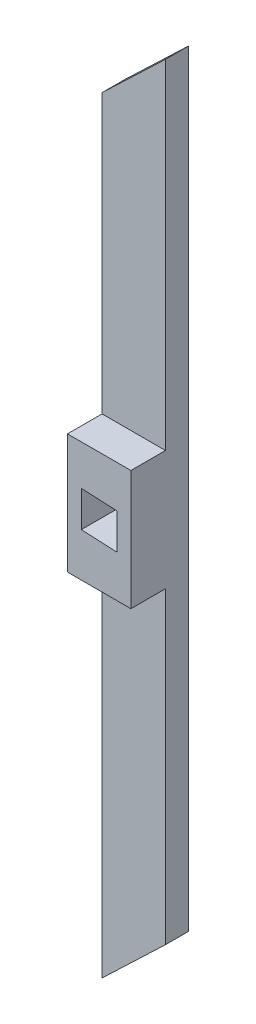
ISO-10303-21;
HEADER;
FILE_DESCRIPTION(('STEP AP214'),'2;1');
FILE_NAME('part.step','',(''),(''),'','','');
FILE_SCHEMA(('AUTOMOTIVE_DESIGN { 1 0 10303 214 1 1 1 1 }'));
ENDSEC;
DATA;
#1=APPLICATION_CONTEXT('core data for automotive mechanical design processes');
#2=APPLICATION_PROTOCOL_DEFINITION('international standard','automotive_design',2000,#1);
#3=PRODUCT_CONTEXT('',#1,'mechanical');
#4=PRODUCT('Part','Part','',(#3));
#5=PRODUCT_RELATED_PRODUCT_CATEGORY('part','',(#4));
#6=PRODUCT_DEFINITION_FORMATION('','',#4);
#7=PRODUCT_DEFINITION_CONTEXT('part definition',#1,'design');
#8=PRODUCT_DEFINITION('design','',#6,#7);
#9=PRODUCT_DEFINITION_SHAPE('','',#8);
#10=(LENGTH_UNIT() NAMED_UNIT(*) SI_UNIT(.MILLI.,.METRE.));
#11=(NAMED_UNIT(*) PLANE_ANGLE_UNIT() SI_UNIT($,.RADIAN.));
#12=(NAMED_UNIT(*) SI_UNIT($,.STERADIAN.) SOLID_ANGLE_UNIT());
#13=UNCERTAINTY_MEASURE_WITH_UNIT(LENGTH_MEASURE(1.E-05),#10,'distance_accuracy_value','');
#14=(GEOMETRIC_REPRESENTATION_CONTEXT(3) GLOBAL_UNCERTAINTY_ASSIGNED_CONTEXT((#13)) GLOBAL_UNIT_ASSIGNED_CONTEXT((#10,
#11,#12)) REPRESENTATION_CONTEXT('',''));
#15=CARTESIAN_POINT('',(0.,0.,0.));
#16=DIRECTION('',(0.,0.,1.));
#17=DIRECTION('',(1.,0.,0.));
#18=AXIS2_PLACEMENT_3D('',#15,#16,#17);
#19=CARTESIAN_POINT('',(34.212972972973,-35.8421621621622,10.));
#20=DIRECTION('',(0.6904757466825,-0.723355544143572,0.));
#21=DIRECTION('',(0.723355544143572,0.690475746682501,0.));
#22=AXIS2_PLACEMENT_3D('',#19,#20,#21);
#23=PLANE('',#22);
#24=DIRECTION('',(0.723355544143572,0.690475746682501,0.));
#25=VECTOR('',#24,1.);
#26=CARTESIAN_POINT('',(34.212972972973,-35.8421621621622,4.));
#27=LINE('',#26,#25);
#28=CARTESIAN_POINT('',(0.,-68.5,4.));
#29=VERTEX_POINT('',#28);
#30=CARTESIAN_POINT('',(11.,-58.,4.));
#31=VERTEX_POINT('',#30);
#32=EDGE_CURVE('E188',#29,#31,#27,.T.);
#33=ORIENTED_EDGE('',*,*,#32,.F.);
#34=DIRECTION('',(0.,0.,-1.));
#35=VECTOR('',#34,1.);
#36=CARTESIAN_POINT('',(0.,-68.5,10.));
#37=LINE('',#36,#35);
#38=CARTESIAN_POINT('',(0.,-68.5,0.));
#39=VERTEX_POINT('',#38);
#40=EDGE_CURVE('E156',#29,#39,#37,.T.);
#41=ORIENTED_EDGE('',*,*,#40,.T.);
#42=DIRECTION('',(-0.723355544143572,-0.690475746682501,0.));
#43=VECTOR('',#42,1.);
#44=CARTESIAN_POINT('',(34.212972972973,-35.8421621621622,0.));
#45=LINE('',#44,#43);
#46=CARTESIAN_POINT('',(11.,-58.,0.));
#47=VERTEX_POINT('',#46);
#48=EDGE_CURVE('E164',#47,#39,#45,.T.);
#49=ORIENTED_EDGE('',*,*,#48,.F.);
#50=DIRECTION('',(0.,0.,-1.));
#51=VECTOR('',#50,1.);
#52=CARTESIAN_POINT('',(11.,-58.,10.));
#53=LINE('',#52,#51);
#54=EDGE_CURVE('E158',#31,#47,#53,.T.);
#55=ORIENTED_EDGE('',*,*,#54,.F.);
#56=EDGE_LOOP('',(#33,#41,#49,#55));
#57=FACE_BOUND('',#56,.T.);
#58=ADVANCED_FACE('F41',(#57),#23,.T.);
#59=CARTESIAN_POINT('',(11.,0.,10.));
#60=DIRECTION('',(1.,0.,0.));
#61=DIRECTION('',(0.,1.,0.));
#62=AXIS2_PLACEMENT_3D('',#59,#60,#61);
#63=PLANE('',#62);
#64=DIRECTION('',(0.,0.,-1.));
#65=VECTOR('',#64,1.);
#66=CARTESIAN_POINT('',(11.,16.2385989171019,10.));
#67=LINE('',#66,#65);
#68=CARTESIAN_POINT('',(11.,16.2385989171019,10.));
#69=VERTEX_POINT('',#68);
#70=CARTESIAN_POINT('',(11.,16.2385989171019,4.));
#71=VERTEX_POINT('',#70);
#72=EDGE_CURVE('E141',#69,#71,#67,.T.);
#73=ORIENTED_EDGE('',*,*,#72,.F.);
#74=DIRECTION('',(0.,-1.,0.));
#75=VECTOR('',#74,1.);
#76=CARTESIAN_POINT('',(11.,0.,10.));
#77=LINE('',#76,#75);
#78=CARTESIAN_POINT('',(11.,-4.52546343834662,10.));
#79=VERTEX_POINT('',#78);
#80=EDGE_CURVE('E150',#69,#79,#77,.T.);
#81=ORIENTED_EDGE('',*,*,#80,.T.);
#82=DIRECTION('',(0.,0.,1.));
#83=VECTOR('',#82,1.);
#84=CARTESIAN_POINT('',(11.,-4.52546343834662,10.));
#85=LINE('',#84,#83);
#86=CARTESIAN_POINT('',(11.,-4.52546343834662,4.));
#87=VERTEX_POINT('',#86);
#88=EDGE_CURVE('E56',#87,#79,#85,.T.);
#89=ORIENTED_EDGE('',*,*,#88,.F.);
#90=DIRECTION('',(0.,1.,0.));
#91=VECTOR('',#90,1.);
#92=CARTESIAN_POINT('',(11.,0.,4.));
#93=LINE('',#92,#91);
#94=EDGE_CURVE('E190',#31,#87,#93,.T.);
#95=ORIENTED_EDGE('',*,*,#94,.F.);
#96=ORIENTED_EDGE('',*,*,#54,.T.);
#97=DIRECTION('',(0.,-1.,0.));
#98=VECTOR('',#97,1.);
#99=CARTESIAN_POINT('',(11.,0.,0.));
#100=LINE('',#99,#98);
#101=CARTESIAN_POINT('',(11.,75.,0.));
#102=VERTEX_POINT('',#101);
#103=EDGE_CURVE('E167',#102,#47,#100,.T.);
#104=ORIENTED_EDGE('',*,*,#103,.F.);
#105=DIRECTION('',(0.,0.,-1.));
#106=VECTOR('',#105,1.);
#107=CARTESIAN_POINT('',(11.,75.,10.));
#108=LINE('',#107,#106);
#109=CARTESIAN_POINT('',(11.,75.,4.));
#110=VERTEX_POINT('',#109);
#111=EDGE_CURVE('E168',#110,#102,#108,.T.);
#112=ORIENTED_EDGE('',*,*,#111,.F.);
#113=DIRECTION('',(0.,1.,0.));
#114=VECTOR('',#113,1.);
#115=CARTESIAN_POINT('',(11.,0.,4.));
#116=LINE('',#115,#114);
#117=EDGE_CURVE('E64',#71,#110,#116,.T.);
#118=ORIENTED_EDGE('',*,*,#117,.F.);
#119=EDGE_LOOP('',(#73,#81,#89,#95,#96,#104,#112,#118));
#120=FACE_BOUND('',#119,.T.);
#121=ADVANCED_FACE('F185',(#120),#63,.T.);
#122=CARTESIAN_POINT('',(0.,0.,10.));
#123=DIRECTION('',(1.,0.,0.));
#124=DIRECTION('',(0.,1.,0.));
#125=AXIS2_PLACEMENT_3D('',#122,#123,#124);
#126=PLANE('',#125);
#127=DIRECTION('',(0.,-1.,0.));
#128=VECTOR('',#127,1.);
#129=CARTESIAN_POINT('',(0.,0.,10.));
#130=LINE('',#129,#128);
#131=CARTESIAN_POINT('',(0.,16.2385989171019,10.));
#132=VERTEX_POINT('',#131);
#133=CARTESIAN_POINT('',(0.,-4.52546343834662,10.));
#134=VERTEX_POINT('',#133);
#135=EDGE_CURVE('E148',#132,#134,#130,.T.);
#136=ORIENTED_EDGE('',*,*,#135,.F.);
#137=DIRECTION('',(0.,0.,-1.));
#138=VECTOR('',#137,1.);
#139=CARTESIAN_POINT('',(0.,16.2385989171019,10.));
#140=LINE('',#139,#138);
#141=CARTESIAN_POINT('',(0.,16.2385989171019,4.));
#142=VERTEX_POINT('',#141);
#143=EDGE_CURVE('E132',#132,#142,#140,.T.);
#144=ORIENTED_EDGE('',*,*,#143,.T.);
#145=DIRECTION('',(0.,1.,0.));
#146=VECTOR('',#145,1.);
#147=CARTESIAN_POINT('',(0.,0.,4.));
#148=LINE('',#147,#146);
#149=CARTESIAN_POINT('',(0.,64.5,4.));
#150=VERTEX_POINT('',#149);
#151=EDGE_CURVE('E445',#142,#150,#148,.T.);
#152=ORIENTED_EDGE('',*,*,#151,.T.);
#153=DIRECTION('',(0.,0.,-1.));
#154=VECTOR('',#153,1.);
#155=CARTESIAN_POINT('',(0.,64.5,10.));
#156=LINE('',#155,#154);
#157=CARTESIAN_POINT('',(0.,64.5,0.));
#158=VERTEX_POINT('',#157);
#159=EDGE_CURVE('E178',#150,#158,#156,.T.);
#160=ORIENTED_EDGE('',*,*,#159,.T.);
#161=DIRECTION('',(0.,-1.,0.));
#162=VECTOR('',#161,1.);
#163=CARTESIAN_POINT('',(0.,0.,0.));
#164=LINE('',#163,#162);
#165=EDGE_CURVE('E160',#158,#39,#164,.T.);
#166=ORIENTED_EDGE('',*,*,#165,.T.);
#167=ORIENTED_EDGE('',*,*,#40,.F.);
#168=DIRECTION('',(0.,1.,0.));
#169=VECTOR('',#168,1.);
#170=CARTESIAN_POINT('',(0.,0.,4.));
#171=LINE('',#170,#169);
#172=CARTESIAN_POINT('',(0.,-4.52546343834662,4.));
#173=VERTEX_POINT('',#172);
#174=EDGE_CURVE('E11',#29,#173,#171,.T.);
#175=ORIENTED_EDGE('',*,*,#174,.T.);
#176=DIRECTION('',(0.,0.,1.));
#177=VECTOR('',#176,1.);
#178=CARTESIAN_POINT('',(0.,-4.52546343834662,10.));
#179=LINE('',#178,#177);
#180=EDGE_CURVE('E155',#173,#134,#179,.T.);
#181=ORIENTED_EDGE('',*,*,#180,.T.);
#182=EDGE_LOOP('',(#136,#144,#152,#160,#166,#167,#175,#181));
#183=FACE_BOUND('',#182,.T.);
#184=ADVANCED_FACE('F154',(#183),#126,.F.);
#185=CARTESIAN_POINT('',(0.,0.,10.));
#186=DIRECTION('',(0.,0.,1.));
#187=DIRECTION('',(1.,0.,0.));
#188=AXIS2_PLACEMENT_3D('',#185,#186,#187);
#189=PLANE('',#188);
#190=DIRECTION('',(1.,0.,0.));
#191=VECTOR('',#190,1.);
#192=CARTESIAN_POINT('',(-15.4156254279121,16.2385989171019,10.));
#193=LINE('',#192,#191);
#194=EDGE_CURVE('E135',#132,#69,#193,.T.);
#195=ORIENTED_EDGE('',*,*,#194,.F.);
#196=ORIENTED_EDGE('',*,*,#135,.T.);
#197=DIRECTION('',(-1.,0.,0.));
#198=VECTOR('',#197,1.);
#199=CARTESIAN_POINT('',(0.,-4.52546343834662,10.));
#200=LINE('',#199,#198);
#201=EDGE_CURVE('E49',#79,#134,#200,.T.);
#202=ORIENTED_EDGE('',*,*,#201,.F.);
#203=ORIENTED_EDGE('',*,*,#80,.F.);
#204=EDGE_LOOP('',(#195,#196,#202,#203));
#205=FACE_BOUND('',#204,.T.);
#206=DIRECTION('',(0.998828690110023,-0.0483864424513327,0.));
#207=VECTOR('',#206,1.);
#208=CARTESIAN_POINT('',(8.59999999999999,2.75656773937766,10.));
#209=LINE('',#208,#207);
#210=CARTESIAN_POINT('',(2.40726212131785,3.05656368257592,10.));
#211=VERTEX_POINT('',#210);
#212=CARTESIAN_POINT('',(8.59999999999999,2.75656773937766,10.));
#213=VERTEX_POINT('',#212);
#214=EDGE_CURVE('E195',#211,#213,#209,.T.);
#215=ORIENTED_EDGE('',*,*,#214,.F.);
#216=DIRECTION('',(0.,-1.,0.));
#217=VECTOR('',#216,1.);
#218=CARTESIAN_POINT('',(2.40726212131785,3.05656368257592,10.));
#219=LINE('',#218,#217);
#220=CARTESIAN_POINT('',(2.40726212131784,9.25656368257592,10.));
#221=VERTEX_POINT('',#220);
#222=EDGE_CURVE('E200',#221,#211,#219,.T.);
#223=ORIENTED_EDGE('',*,*,#222,.F.);
#224=DIRECTION('',(-0.998828690110023,0.0483864424513328,0.));
#225=VECTOR('',#224,1.);
#226=CARTESIAN_POINT('',(2.40726212131784,9.25656368257592,10.));
#227=LINE('',#226,#225);
#228=CARTESIAN_POINT('',(8.59999999999999,8.95656773937766,10.));
#229=VERTEX_POINT('',#228);
#230=EDGE_CURVE('E214',#229,#221,#227,.T.);
#231=ORIENTED_EDGE('',*,*,#230,.F.);
#232=DIRECTION('',(0.,1.,0.));
#233=VECTOR('',#232,1.);
#234=CARTESIAN_POINT('',(8.59999999999999,8.95656773937766,10.));
#235=LINE('',#234,#233);
#236=EDGE_CURVE('E211',#213,#229,#235,.T.);
#237=ORIENTED_EDGE('',*,*,#236,.F.);
#238=EDGE_LOOP('',(#215,#223,#231,#237));
#239=FACE_BOUND('',#238,.T.);
#240=ADVANCED_FACE('F146',(#205,#239),#189,.T.);
#241=CARTESIAN_POINT('',(0.,0.,0.));
#242=DIRECTION('',(0.,0.,1.));
#243=DIRECTION('',(1.,0.,0.));
#244=AXIS2_PLACEMENT_3D('',#241,#242,#243);
#245=PLANE('',#244);
#246=ORIENTED_EDGE('',*,*,#48,.T.);
#247=ORIENTED_EDGE('',*,*,#165,.F.);
#248=DIRECTION('',(-0.723355544143571,-0.690475746682501,0.));
#249=VECTOR('',#248,1.);
#250=CARTESIAN_POINT('',(-32.2151351351351,33.7491891891891,0.));
#251=LINE('',#250,#249);
#252=EDGE_CURVE('E175',#102,#158,#251,.T.);
#253=ORIENTED_EDGE('',*,*,#252,.F.);
#254=ORIENTED_EDGE('',*,*,#103,.T.);
#255=EDGE_LOOP('',(#246,#247,#253,#254));
#256=FACE_BOUND('',#255,.T.);
#257=ADVANCED_FACE('F250',(#256),#245,.F.);
#258=CARTESIAN_POINT('',(-32.2151351351351,33.7491891891891,10.));
#259=DIRECTION('',(0.690475746682501,-0.723355544143571,0.));
#260=DIRECTION('',(0.723355544143571,0.690475746682501,0.));
#261=AXIS2_PLACEMENT_3D('',#258,#259,#260);
#262=PLANE('',#261);
#263=ORIENTED_EDGE('',*,*,#159,.F.);
#264=DIRECTION('',(0.723355544143571,0.690475746682501,0.));
#265=VECTOR('',#264,1.);
#266=CARTESIAN_POINT('',(-32.2151351351351,33.7491891891891,4.));
#267=LINE('',#266,#265);
#268=EDGE_CURVE('E174',#150,#110,#267,.T.);
#269=ORIENTED_EDGE('',*,*,#268,.T.);
#270=ORIENTED_EDGE('',*,*,#111,.T.);
#271=ORIENTED_EDGE('',*,*,#252,.T.);
#272=EDGE_LOOP('',(#263,#269,#270,#271));
#273=FACE_BOUND('',#272,.T.);
#274=ADVANCED_FACE('F43',(#273),#262,.F.);
#275=CARTESIAN_POINT('',(8.59999999999999,2.75656773937766,3.));
#276=DIRECTION('',(-0.0483864424513327,-0.998828690110023,0.));
#277=DIRECTION('',(0.998828690110023,-0.0483864424513327,0.));
#278=AXIS2_PLACEMENT_3D('',#275,#276,#277);
#279=PLANE('',#278);
#280=ORIENTED_EDGE('',*,*,#214,.T.);
#281=DIRECTION('',(0.,0.,1.));
#282=VECTOR('',#281,1.);
#283=CARTESIAN_POINT('',(8.59999999999999,2.75656773937766,3.));
#284=LINE('',#283,#282);
#285=CARTESIAN_POINT('',(8.59999999999999,2.75656773937766,3.));
#286=VERTEX_POINT('',#285);
#287=EDGE_CURVE('E209',#286,#213,#284,.T.);
#288=ORIENTED_EDGE('',*,*,#287,.F.);
#289=DIRECTION('',(0.998828690110023,-0.0483864424513327,0.));
#290=VECTOR('',#289,1.);
#291=CARTESIAN_POINT('',(8.59999999999999,2.75656773937766,3.));
#292=LINE('',#291,#290);
#293=CARTESIAN_POINT('',(2.40726212131785,3.05656368257592,3.));
#294=VERTEX_POINT('',#293);
#295=EDGE_CURVE('E196',#294,#286,#292,.T.);
#296=ORIENTED_EDGE('',*,*,#295,.F.);
#297=DIRECTION('',(0.,0.,1.));
#298=VECTOR('',#297,1.);
#299=CARTESIAN_POINT('',(2.40726212131785,3.05656368257592,3.));
#300=LINE('',#299,#298);
#301=EDGE_CURVE('E179',#294,#211,#300,.T.);
#302=ORIENTED_EDGE('',*,*,#301,.T.);
#303=EDGE_LOOP('',(#280,#288,#296,#302));
#304=FACE_BOUND('',#303,.T.);
#305=ADVANCED_FACE('F239',(#304),#279,.F.);
#306=CARTESIAN_POINT('',(2.40726212131785,3.05656368257592,3.));
#307=DIRECTION('',(-1.,0.,0.));
#308=DIRECTION('',(0.,-1.,0.));
#309=AXIS2_PLACEMENT_3D('',#306,#307,#308);
#310=PLANE('',#309);
#311=ORIENTED_EDGE('',*,*,#222,.T.);
#312=ORIENTED_EDGE('',*,*,#301,.F.);
#313=DIRECTION('',(0.,-1.,0.));
#314=VECTOR('',#313,1.);
#315=CARTESIAN_POINT('',(2.40726212131785,3.05656368257592,3.));
#316=LINE('',#315,#314);
#317=CARTESIAN_POINT('',(2.40726212131784,9.25656368257592,3.));
#318=VERTEX_POINT('',#317);
#319=EDGE_CURVE('E206',#318,#294,#316,.T.);
#320=ORIENTED_EDGE('',*,*,#319,.F.);
#321=DIRECTION('',(0.,0.,1.));
#322=VECTOR('',#321,1.);
#323=CARTESIAN_POINT('',(2.40726212131784,9.25656368257592,3.));
#324=LINE('',#323,#322);
#325=EDGE_CURVE('E220',#318,#221,#324,.T.);
#326=ORIENTED_EDGE('',*,*,#325,.T.);
#327=EDGE_LOOP('',(#311,#312,#320,#326));
#328=FACE_BOUND('',#327,.T.);
#329=ADVANCED_FACE('F241',(#328),#310,.F.);
#330=CARTESIAN_POINT('',(2.40726212131784,9.25656368257592,3.));
#331=DIRECTION('',(0.0483864424513328,0.998828690110023,0.));
#332=DIRECTION('',(-0.998828690110023,0.0483864424513328,0.));
#333=AXIS2_PLACEMENT_3D('',#330,#331,#332);
#334=PLANE('',#333);
#335=ORIENTED_EDGE('',*,*,#230,.T.);
#336=ORIENTED_EDGE('',*,*,#325,.F.);
#337=DIRECTION('',(-0.998828690110023,0.0483864424513328,0.));
#338=VECTOR('',#337,1.);
#339=CARTESIAN_POINT('',(2.40726212131784,9.25656368257592,3.));
#340=LINE('',#339,#338);
#341=CARTESIAN_POINT('',(8.59999999999999,8.95656773937766,3.));
#342=VERTEX_POINT('',#341);
#343=EDGE_CURVE('E203',#342,#318,#340,.T.);
#344=ORIENTED_EDGE('',*,*,#343,.F.);
#345=DIRECTION('',(0.,0.,1.));
#346=VECTOR('',#345,1.);
#347=CARTESIAN_POINT('',(8.59999999999999,8.95656773937766,3.));
#348=LINE('',#347,#346);
#349=EDGE_CURVE('E222',#342,#229,#348,.T.);
#350=ORIENTED_EDGE('',*,*,#349,.T.);
#351=EDGE_LOOP('',(#335,#336,#344,#350));
#352=FACE_BOUND('',#351,.T.);
#353=ADVANCED_FACE('F234',(#352),#334,.F.);
#354=CARTESIAN_POINT('',(8.59999999999999,8.95656773937766,3.));
#355=DIRECTION('',(1.,0.,0.));
#356=DIRECTION('',(0.,0.,-1.));
#357=AXIS2_PLACEMENT_3D('',#354,#355,#356);
#358=PLANE('',#357);
#359=ORIENTED_EDGE('',*,*,#236,.T.);
#360=ORIENTED_EDGE('',*,*,#349,.F.);
#361=DIRECTION('',(0.,1.,0.));
#362=VECTOR('',#361,1.);
#363=CARTESIAN_POINT('',(8.59999999999999,8.95656773937766,3.));
#364=LINE('',#363,#362);
#365=EDGE_CURVE('E199',#286,#342,#364,.T.);
#366=ORIENTED_EDGE('',*,*,#365,.F.);
#367=ORIENTED_EDGE('',*,*,#287,.T.);
#368=EDGE_LOOP('',(#359,#360,#366,#367));
#369=FACE_BOUND('',#368,.T.);
#370=ADVANCED_FACE('F227',(#369),#358,.F.);
#371=CARTESIAN_POINT('',(0.,0.,3.));
#372=DIRECTION('',(0.,0.,-1.));
#373=DIRECTION('',(-1.,0.,0.));
#374=AXIS2_PLACEMENT_3D('',#371,#372,#373);
#375=PLANE('',#374);
#376=ORIENTED_EDGE('',*,*,#295,.T.);
#377=ORIENTED_EDGE('',*,*,#365,.T.);
#378=ORIENTED_EDGE('',*,*,#343,.T.);
#379=ORIENTED_EDGE('',*,*,#319,.T.);
#380=EDGE_LOOP('',(#376,#377,#378,#379));
#381=FACE_BOUND('',#380,.T.);
#382=ADVANCED_FACE('F238',(#381),#375,.F.);
#383=CARTESIAN_POINT('',(-15.4156254279121,16.2385989171019,4.));
#384=DIRECTION('',(0.,-1.,0.));
#385=DIRECTION('',(0.,0.,-1.));
#386=AXIS2_PLACEMENT_3D('',#383,#384,#385);
#387=PLANE('',#386);
#388=ORIENTED_EDGE('',*,*,#72,.T.);
#389=DIRECTION('',(1.,0.,0.));
#390=VECTOR('',#389,1.);
#391=CARTESIAN_POINT('',(-15.4156254279121,16.2385989171019,4.));
#392=LINE('',#391,#390);
#393=EDGE_CURVE('E137',#142,#71,#392,.T.);
#394=ORIENTED_EDGE('',*,*,#393,.F.);
#395=ORIENTED_EDGE('',*,*,#143,.F.);
#396=ORIENTED_EDGE('',*,*,#194,.T.);
#397=EDGE_LOOP('',(#388,#394,#395,#396));
#398=FACE_BOUND('',#397,.T.);
#399=ADVANCED_FACE('F134',(#398),#387,.F.);
#400=CARTESIAN_POINT('',(0.,0.,4.));
#401=DIRECTION('',(0.,0.,-1.));
#402=DIRECTION('',(-1.,0.,0.));
#403=AXIS2_PLACEMENT_3D('',#400,#401,#402);
#404=PLANE('',#403);
#405=ORIENTED_EDGE('',*,*,#117,.T.);
#406=ORIENTED_EDGE('',*,*,#268,.F.);
#407=ORIENTED_EDGE('',*,*,#151,.F.);
#408=ORIENTED_EDGE('',*,*,#393,.T.);
#409=EDGE_LOOP('',(#405,#406,#407,#408));
#410=FACE_BOUND('',#409,.T.);
#411=ADVANCED_FACE('F279',(#410),#404,.F.);
#412=CARTESIAN_POINT('',(-15.4156254279121,-4.52546343834662,4.));
#413=DIRECTION('',(0.,1.,0.));
#414=DIRECTION('',(0.,0.,1.));
#415=AXIS2_PLACEMENT_3D('',#412,#413,#414);
#416=PLANE('',#415);
#417=ORIENTED_EDGE('',*,*,#88,.T.);
#418=ORIENTED_EDGE('',*,*,#201,.T.);
#419=ORIENTED_EDGE('',*,*,#180,.F.);
#420=DIRECTION('',(-1.,0.,0.));
#421=VECTOR('',#420,1.);
#422=CARTESIAN_POINT('',(-15.4156254279121,-4.52546343834662,4.));
#423=LINE('',#422,#421);
#424=EDGE_CURVE('E151',#87,#173,#423,.T.);
#425=ORIENTED_EDGE('',*,*,#424,.F.);
#426=EDGE_LOOP('',(#417,#418,#419,#425));
#427=FACE_BOUND('',#426,.T.);
#428=ADVANCED_FACE('F182',(#427),#416,.F.);
#429=CARTESIAN_POINT('',(0.,0.,4.));
#430=DIRECTION('',(0.,0.,-1.));
#431=DIRECTION('',(-1.,0.,0.));
#432=AXIS2_PLACEMENT_3D('',#429,#430,#431);
#433=PLANE('',#432);
#434=ORIENTED_EDGE('',*,*,#94,.T.);
#435=ORIENTED_EDGE('',*,*,#424,.T.);
#436=ORIENTED_EDGE('',*,*,#174,.F.);
#437=ORIENTED_EDGE('',*,*,#32,.T.);
#438=EDGE_LOOP('',(#434,#435,#436,#437));
#439=FACE_BOUND('',#438,.T.);
#440=ADVANCED_FACE('F282',(#439),#433,.F.);
#441=CLOSED_SHELL('',(#58,#121,#184,#240,#257,#274,#305,#329,#353,#370,#382,#399,#411,#428,#440));
#442=MANIFOLD_SOLID_BREP('B2',#441);
#443=ADVANCED_BREP_SHAPE_REPRESENTATION('',(#18,#442),#14);
#444=SHAPE_DEFINITION_REPRESENTATION(#9,#443);
ENDSEC;
END-ISO-10303-21;
